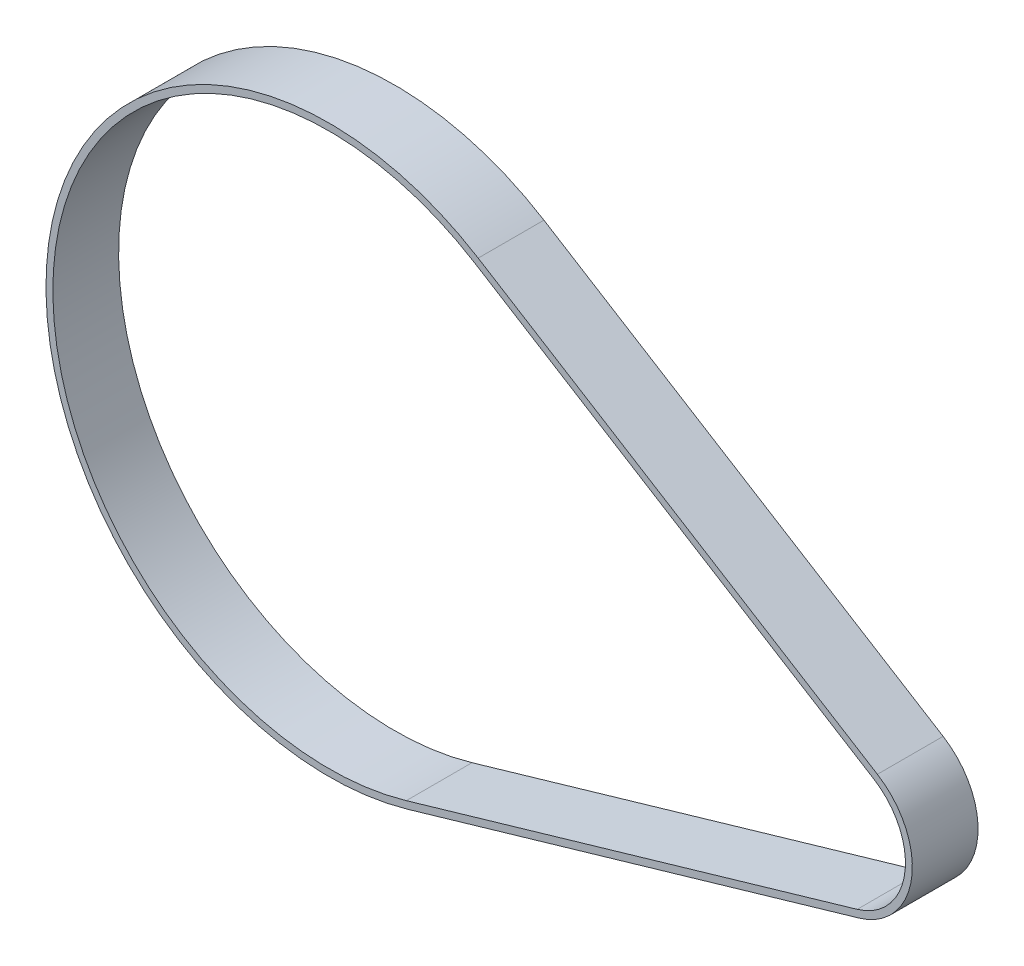
ISO-10303-21;
HEADER;
FILE_DESCRIPTION(('STEP AP214'),'2;1');
FILE_NAME('part.step','',(''),(''),'','','');
FILE_SCHEMA(('AUTOMOTIVE_DESIGN { 1 0 10303 214 1 1 1 1 }'));
ENDSEC;
DATA;
#1=APPLICATION_CONTEXT('core data for automotive mechanical design processes');
#2=APPLICATION_PROTOCOL_DEFINITION('international standard','automotive_design',2000,#1);
#3=PRODUCT_CONTEXT('',#1,'mechanical');
#4=PRODUCT('Part','Part','',(#3));
#5=PRODUCT_RELATED_PRODUCT_CATEGORY('part','',(#4));
#6=PRODUCT_DEFINITION_FORMATION('','',#4);
#7=PRODUCT_DEFINITION_CONTEXT('part definition',#1,'design');
#8=PRODUCT_DEFINITION('design','',#6,#7);
#9=PRODUCT_DEFINITION_SHAPE('','',#8);
#10=(LENGTH_UNIT() NAMED_UNIT(*) SI_UNIT(.MILLI.,.METRE.));
#11=(NAMED_UNIT(*) PLANE_ANGLE_UNIT() SI_UNIT($,.RADIAN.));
#12=(NAMED_UNIT(*) SI_UNIT($,.STERADIAN.) SOLID_ANGLE_UNIT());
#13=UNCERTAINTY_MEASURE_WITH_UNIT(LENGTH_MEASURE(1.E-05),#10,'distance_accuracy_value','');
#14=(GEOMETRIC_REPRESENTATION_CONTEXT(3) GLOBAL_UNCERTAINTY_ASSIGNED_CONTEXT((#13)) GLOBAL_UNIT_ASSIGNED_CONTEXT((#10,
#11,#12)) REPRESENTATION_CONTEXT('',''));
#15=CARTESIAN_POINT('',(0.,0.,0.));
#16=DIRECTION('',(0.,0.,1.));
#17=DIRECTION('',(1.,0.,0.));
#18=AXIS2_PLACEMENT_3D('',#15,#16,#17);
#19=CARTESIAN_POINT('',(46.5,-6.35,0.));
#20=DIRECTION('',(0.,0.,1.));
#21=DIRECTION('',(1.,0.,0.));
#22=AXIS2_PLACEMENT_3D('',#19,#20,#21);
#23=CYLINDRICAL_SURFACE('',#22,6.74);
#24=DIRECTION('',(0.,0.,1.));
#25=VECTOR('',#24,1.);
#26=CARTESIAN_POINT('',(48.3847847272979,-12.8211039654563,0.));
#27=LINE('',#26,#25);
#28=CARTESIAN_POINT('',(48.3847847272979,-12.8211039654563,-3.));
#29=VERTEX_POINT('',#28);
#30=CARTESIAN_POINT('',(48.3847847272979,-12.8211039654563,3.));
#31=VERTEX_POINT('',#30);
#32=EDGE_CURVE('E79',#29,#31,#27,.T.);
#33=ORIENTED_EDGE('',*,*,#32,.F.);
#34=CARTESIAN_POINT('',(46.5,-6.35,-3.));
#35=DIRECTION('',(0.,0.,1.));
#36=DIRECTION('',(1.,0.,0.));
#37=AXIS2_PLACEMENT_3D('',#34,#35,#36);
#38=CIRCLE('',#37,6.74);
#39=CARTESIAN_POINT('',(50.0507966213297,-0.621174347743355,-3.));
#40=VERTEX_POINT('',#39);
#41=EDGE_CURVE('E125',#29,#40,#38,.T.);
#42=ORIENTED_EDGE('',*,*,#41,.T.);
#43=DIRECTION('',(0.,0.,1.));
#44=VECTOR('',#43,1.);
#45=CARTESIAN_POINT('',(50.0507966213297,-0.62117434774335,0.));
#46=LINE('',#45,#44);
#47=CARTESIAN_POINT('',(50.0507966213297,-0.621174347743352,3.));
#48=VERTEX_POINT('',#47);
#49=EDGE_CURVE('E93',#48,#40,#46,.F.);
#50=ORIENTED_EDGE('',*,*,#49,.F.);
#51=CARTESIAN_POINT('',(46.5,-6.35,3.));
#52=DIRECTION('',(0.,0.,1.));
#53=DIRECTION('',(1.,0.,0.));
#54=AXIS2_PLACEMENT_3D('',#51,#52,#53);
#55=CIRCLE('',#54,6.74);
#56=EDGE_CURVE('E20',#31,#48,#55,.T.);
#57=ORIENTED_EDGE('',*,*,#56,.F.);
#58=EDGE_LOOP('',(#33,#42,#50,#57));
#59=FACE_BOUND('',#58,.T.);
#60=ADVANCED_FACE('F17',(#59),#23,.T.);
#61=CARTESIAN_POINT('',(13.2812437423921,21.4278478773577,0.));
#62=DIRECTION('',(-0.526824424529629,-0.849974132382289,0.));
#63=DIRECTION('',(0.849974132382289,-0.526824424529629,0.));
#64=AXIS2_PLACEMENT_3D('',#61,#62,#63);
#65=PLANE('',#64);
#66=DIRECTION('',(0.,0.,1.));
#67=VECTOR('',#66,1.);
#68=CARTESIAN_POINT('',(13.2812437423921,21.4278478773577,0.));
#69=LINE('',#68,#67);
#70=CARTESIAN_POINT('',(13.2812437423921,21.4278478773577,3.));
#71=VERTEX_POINT('',#70);
#72=CARTESIAN_POINT('',(13.2812437423921,21.4278478773577,-3.));
#73=VERTEX_POINT('',#72);
#74=EDGE_CURVE('E89',#71,#73,#69,.F.);
#75=ORIENTED_EDGE('',*,*,#74,.T.);
#76=DIRECTION('',(0.849974132382289,-0.52682442452963,0.));
#77=VECTOR('',#76,1.);
#78=CARTESIAN_POINT('',(13.2812437423921,21.4278478773577,-3.));
#79=LINE('',#78,#77);
#80=CARTESIAN_POINT('',(49.718897233876,-1.15665805114419,-3.));
#81=VERTEX_POINT('',#80);
#82=EDGE_CURVE('E124',#73,#81,#79,.T.);
#83=ORIENTED_EDGE('',*,*,#82,.T.);
#84=DIRECTION('',(0.,0.,1.));
#85=VECTOR('',#84,1.);
#86=CARTESIAN_POINT('',(49.718897233876,-1.15665805114417,0.));
#87=LINE('',#86,#85);
#88=CARTESIAN_POINT('',(49.718897233876,-1.15665805114419,3.));
#89=VERTEX_POINT('',#88);
#90=EDGE_CURVE('E112',#81,#89,#87,.T.);
#91=ORIENTED_EDGE('',*,*,#90,.T.);
#92=DIRECTION('',(0.849974132382289,-0.52682442452963,0.));
#93=VECTOR('',#92,1.);
#94=CARTESIAN_POINT('',(13.2812437423921,21.4278478773577,3.));
#95=LINE('',#94,#93);
#96=EDGE_CURVE('E104',#71,#89,#95,.T.);
#97=ORIENTED_EDGE('',*,*,#96,.F.);
#98=EDGE_LOOP('',(#75,#83,#91,#97));
#99=FACE_BOUND('',#98,.T.);
#100=ADVANCED_FACE('F138',(#99),#65,.T.);
#101=CARTESIAN_POINT('',(46.5,-6.35,0.));
#102=DIRECTION('',(0.,0.,1.));
#103=DIRECTION('',(1.,0.,0.));
#104=AXIS2_PLACEMENT_3D('',#101,#102,#103);
#105=CYLINDRICAL_SURFACE('',#104,6.11);
#106=CARTESIAN_POINT('',(46.5,-6.35,3.));
#107=DIRECTION('',(0.,0.,1.));
#108=DIRECTION('',(1.,0.,0.));
#109=AXIS2_PLACEMENT_3D('',#106,#107,#108);
#110=CIRCLE('',#109,6.11);
#111=CARTESIAN_POINT('',(48.2086104872093,-12.2162381645309,3.));
#112=VERTEX_POINT('',#111);
#113=EDGE_CURVE('E127',#89,#112,#110,.F.);
#114=ORIENTED_EDGE('',*,*,#113,.F.);
#115=ORIENTED_EDGE('',*,*,#90,.F.);
#116=CARTESIAN_POINT('',(46.5,-6.35,-3.));
#117=DIRECTION('',(0.,0.,1.));
#118=DIRECTION('',(1.,0.,0.));
#119=AXIS2_PLACEMENT_3D('',#116,#117,#118);
#120=CIRCLE('',#119,6.11);
#121=CARTESIAN_POINT('',(48.2086104872093,-12.2162381645309,-3.));
#122=VERTEX_POINT('',#121);
#123=EDGE_CURVE('E122',#81,#122,#120,.F.);
#124=ORIENTED_EDGE('',*,*,#123,.T.);
#125=DIRECTION('',(0.,0.,1.));
#126=VECTOR('',#125,1.);
#127=CARTESIAN_POINT('',(48.2086104872093,-12.2162381645309,0.));
#128=LINE('',#127,#126);
#129=EDGE_CURVE('E109',#112,#122,#128,.F.);
#130=ORIENTED_EDGE('',*,*,#129,.F.);
#131=EDGE_LOOP('',(#114,#115,#124,#130));
#132=FACE_BOUND('',#131,.T.);
#133=ADVANCED_FACE('F143',(#132),#105,.F.);
#134=CARTESIAN_POINT('',(48.2086104872093,-12.2162381645309,0.));
#135=DIRECTION('',(-0.279641650934412,0.9601044459134,0.));
#136=DIRECTION('',(-0.9601044459134,-0.279641650934412,0.));
#137=AXIS2_PLACEMENT_3D('',#134,#135,#136);
#138=PLANE('',#137);
#139=ORIENTED_EDGE('',*,*,#129,.T.);
#140=DIRECTION('',(-0.9601044459134,-0.279641650934412,0.));
#141=VECTOR('',#140,1.);
#142=CARTESIAN_POINT('',(48.2086104872093,-12.2162381645309,-3.));
#143=LINE('',#142,#141);
#144=CARTESIAN_POINT('',(7.04976602005661,-24.2042330814771,-3.));
#145=VERTEX_POINT('',#144);
#146=EDGE_CURVE('E121',#122,#145,#143,.T.);
#147=ORIENTED_EDGE('',*,*,#146,.T.);
#148=DIRECTION('',(0.,0.,1.));
#149=VECTOR('',#148,1.);
#150=CARTESIAN_POINT('',(7.0497660200566,-24.2042330814771,0.));
#151=LINE('',#150,#149);
#152=CARTESIAN_POINT('',(7.04976602005661,-24.2042330814771,3.));
#153=VERTEX_POINT('',#152);
#154=EDGE_CURVE('E107',#145,#153,#151,.T.);
#155=ORIENTED_EDGE('',*,*,#154,.T.);
#156=DIRECTION('',(-0.9601044459134,-0.279641650934412,0.));
#157=VECTOR('',#156,1.);
#158=CARTESIAN_POINT('',(48.2086104872093,-12.2162381645309,3.));
#159=LINE('',#158,#157);
#160=EDGE_CURVE('E129',#112,#153,#159,.T.);
#161=ORIENTED_EDGE('',*,*,#160,.F.);
#162=EDGE_LOOP('',(#139,#147,#155,#161));
#163=FACE_BOUND('',#162,.T.);
#164=ADVANCED_FACE('F147',(#163),#138,.T.);
#165=CARTESIAN_POINT('',(0.,0.,0.));
#166=DIRECTION('',(0.,0.,1.));
#167=DIRECTION('',(1.,0.,0.));
#168=AXIS2_PLACEMENT_3D('',#165,#166,#167);
#169=CYLINDRICAL_SURFACE('',#168,25.21);
#170=CARTESIAN_POINT('',(0.,0.,3.));
#171=DIRECTION('',(0.,0.,1.));
#172=DIRECTION('',(1.,0.,0.));
#173=AXIS2_PLACEMENT_3D('',#170,#171,#172);
#174=CIRCLE('',#173,25.21);
#175=EDGE_CURVE('E96',#153,#71,#174,.F.);
#176=ORIENTED_EDGE('',*,*,#175,.F.);
#177=ORIENTED_EDGE('',*,*,#154,.F.);
#178=CARTESIAN_POINT('',(0.,0.,-3.));
#179=DIRECTION('',(0.,0.,1.));
#180=DIRECTION('',(1.,0.,0.));
#181=AXIS2_PLACEMENT_3D('',#178,#179,#180);
#182=CIRCLE('',#181,25.21);
#183=EDGE_CURVE('E118',#145,#73,#182,.F.);
#184=ORIENTED_EDGE('',*,*,#183,.T.);
#185=ORIENTED_EDGE('',*,*,#74,.F.);
#186=EDGE_LOOP('',(#176,#177,#184,#185));
#187=FACE_BOUND('',#186,.T.);
#188=ADVANCED_FACE('F160',(#187),#169,.F.);
#189=CARTESIAN_POINT('',(7.22594026014525,-24.8090988824025,0.));
#190=DIRECTION('',(0.279641650934412,-0.9601044459134,0.));
#191=DIRECTION('',(0.9601044459134,0.279641650934412,0.));
#192=AXIS2_PLACEMENT_3D('',#189,#190,#191);
#193=PLANE('',#192);
#194=DIRECTION('',(0.,0.,1.));
#195=VECTOR('',#194,1.);
#196=CARTESIAN_POINT('',(7.22594026014525,-24.8090988824025,0.));
#197=LINE('',#196,#195);
#198=CARTESIAN_POINT('',(7.22594026014527,-24.8090988824025,-3.));
#199=VERTEX_POINT('',#198);
#200=CARTESIAN_POINT('',(7.22594026014527,-24.8090988824025,3.));
#201=VERTEX_POINT('',#200);
#202=EDGE_CURVE('E117',#199,#201,#197,.T.);
#203=ORIENTED_EDGE('',*,*,#202,.F.);
#204=DIRECTION('',(0.9601044459134,0.279641650934413,0.));
#205=VECTOR('',#204,1.);
#206=CARTESIAN_POINT('',(7.22594026014525,-24.8090988824025,-3.));
#207=LINE('',#206,#205);
#208=EDGE_CURVE('E86',#199,#29,#207,.T.);
#209=ORIENTED_EDGE('',*,*,#208,.T.);
#210=ORIENTED_EDGE('',*,*,#32,.T.);
#211=DIRECTION('',(0.9601044459134,0.279641650934413,0.));
#212=VECTOR('',#211,1.);
#213=CARTESIAN_POINT('',(7.22594026014525,-24.8090988824025,3.));
#214=LINE('',#213,#212);
#215=EDGE_CURVE('E83',#201,#31,#214,.T.);
#216=ORIENTED_EDGE('',*,*,#215,.F.);
#217=EDGE_LOOP('',(#203,#209,#210,#216));
#218=FACE_BOUND('',#217,.T.);
#219=ADVANCED_FACE('F81',(#218),#193,.T.);
#220=CARTESIAN_POINT('',(13.7,0.,3.));
#221=DIRECTION('',(0.,0.,1.));
#222=DIRECTION('',(1.,0.,0.));
#223=AXIS2_PLACEMENT_3D('',#220,#221,#222);
#224=PLANE('',#223);
#225=ORIENTED_EDGE('',*,*,#113,.T.);
#226=ORIENTED_EDGE('',*,*,#160,.T.);
#227=ORIENTED_EDGE('',*,*,#175,.T.);
#228=ORIENTED_EDGE('',*,*,#96,.T.);
#229=EDGE_LOOP('',(#225,#226,#227,#228));
#230=FACE_BOUND('',#229,.T.);
#231=ORIENTED_EDGE('',*,*,#56,.T.);
#232=DIRECTION('',(-0.849974132382289,0.526824424529629,0.));
#233=VECTOR('',#232,1.);
#234=CARTESIAN_POINT('',(50.0507966213297,-0.62117434774335,3.));
#235=LINE('',#234,#233);
#236=CARTESIAN_POINT('',(13.6131431298458,21.9633315807585,3.));
#237=VERTEX_POINT('',#236);
#238=EDGE_CURVE('E114',#237,#48,#235,.F.);
#239=ORIENTED_EDGE('',*,*,#238,.F.);
#240=CARTESIAN_POINT('',(0.,0.,3.));
#241=DIRECTION('',(0.,0.,1.));
#242=DIRECTION('',(1.,0.,0.));
#243=AXIS2_PLACEMENT_3D('',#240,#241,#242);
#244=CIRCLE('',#243,25.84);
#245=EDGE_CURVE('E99',#201,#237,#244,.F.);
#246=ORIENTED_EDGE('',*,*,#245,.F.);
#247=ORIENTED_EDGE('',*,*,#215,.T.);
#248=EDGE_LOOP('',(#231,#239,#246,#247));
#249=FACE_BOUND('',#248,.T.);
#250=ADVANCED_FACE('F97',(#230,#249),#224,.T.);
#251=CARTESIAN_POINT('',(50.0507966213297,-0.62117434774335,0.));
#252=DIRECTION('',(0.526824424529629,0.849974132382289,0.));
#253=DIRECTION('',(-0.849974132382289,0.526824424529629,0.));
#254=AXIS2_PLACEMENT_3D('',#251,#252,#253);
#255=PLANE('',#254);
#256=ORIENTED_EDGE('',*,*,#49,.T.);
#257=DIRECTION('',(-0.849974132382288,0.526824424529631,0.));
#258=VECTOR('',#257,1.);
#259=CARTESIAN_POINT('',(50.0507966213297,-0.62117434774335,-3.));
#260=LINE('',#259,#258);
#261=CARTESIAN_POINT('',(13.6131431298458,21.9633315807586,-3.));
#262=VERTEX_POINT('',#261);
#263=EDGE_CURVE('E35',#40,#262,#260,.T.);
#264=ORIENTED_EDGE('',*,*,#263,.T.);
#265=DIRECTION('',(0.,0.,1.));
#266=VECTOR('',#265,1.);
#267=CARTESIAN_POINT('',(13.6131431298458,21.9633315807586,0.));
#268=LINE('',#267,#266);
#269=EDGE_CURVE('E26',#237,#262,#268,.F.);
#270=ORIENTED_EDGE('',*,*,#269,.F.);
#271=ORIENTED_EDGE('',*,*,#238,.T.);
#272=EDGE_LOOP('',(#256,#264,#270,#271));
#273=FACE_BOUND('',#272,.T.);
#274=ADVANCED_FACE('F165',(#273),#255,.T.);
#275=CARTESIAN_POINT('',(13.7,0.,-3.));
#276=DIRECTION('',(0.,0.,1.));
#277=DIRECTION('',(1.,0.,0.));
#278=AXIS2_PLACEMENT_3D('',#275,#276,#277);
#279=PLANE('',#278);
#280=ORIENTED_EDGE('',*,*,#146,.F.);
#281=ORIENTED_EDGE('',*,*,#123,.F.);
#282=ORIENTED_EDGE('',*,*,#82,.F.);
#283=ORIENTED_EDGE('',*,*,#183,.F.);
#284=EDGE_LOOP('',(#280,#281,#282,#283));
#285=FACE_BOUND('',#284,.T.);
#286=ORIENTED_EDGE('',*,*,#263,.F.);
#287=ORIENTED_EDGE('',*,*,#41,.F.);
#288=ORIENTED_EDGE('',*,*,#208,.F.);
#289=CARTESIAN_POINT('',(0.,0.,-3.));
#290=DIRECTION('',(0.,0.,1.));
#291=DIRECTION('',(1.,0.,0.));
#292=AXIS2_PLACEMENT_3D('',#289,#290,#291);
#293=CIRCLE('',#292,25.84);
#294=EDGE_CURVE('E11',#262,#199,#293,.T.);
#295=ORIENTED_EDGE('',*,*,#294,.F.);
#296=EDGE_LOOP('',(#286,#287,#288,#295));
#297=FACE_BOUND('',#296,.T.);
#298=ADVANCED_FACE('F161',(#285,#297),#279,.F.);
#299=CARTESIAN_POINT('',(0.,0.,0.));
#300=DIRECTION('',(0.,0.,1.));
#301=DIRECTION('',(1.,0.,0.));
#302=AXIS2_PLACEMENT_3D('',#299,#300,#301);
#303=CYLINDRICAL_SURFACE('',#302,25.84);
#304=ORIENTED_EDGE('',*,*,#269,.T.);
#305=ORIENTED_EDGE('',*,*,#294,.T.);
#306=ORIENTED_EDGE('',*,*,#202,.T.);
#307=ORIENTED_EDGE('',*,*,#245,.T.);
#308=EDGE_LOOP('',(#304,#305,#306,#307));
#309=FACE_BOUND('',#308,.T.);
#310=ADVANCED_FACE('F164',(#309),#303,.T.);
#311=CLOSED_SHELL('',(#60,#100,#133,#164,#188,#219,#250,#274,#298,#310));
#312=MANIFOLD_SOLID_BREP('B1',#311);
#313=ADVANCED_BREP_SHAPE_REPRESENTATION('',(#18,#312),#14);
#314=SHAPE_DEFINITION_REPRESENTATION(#9,#313);
ENDSEC;
END-ISO-10303-21;
